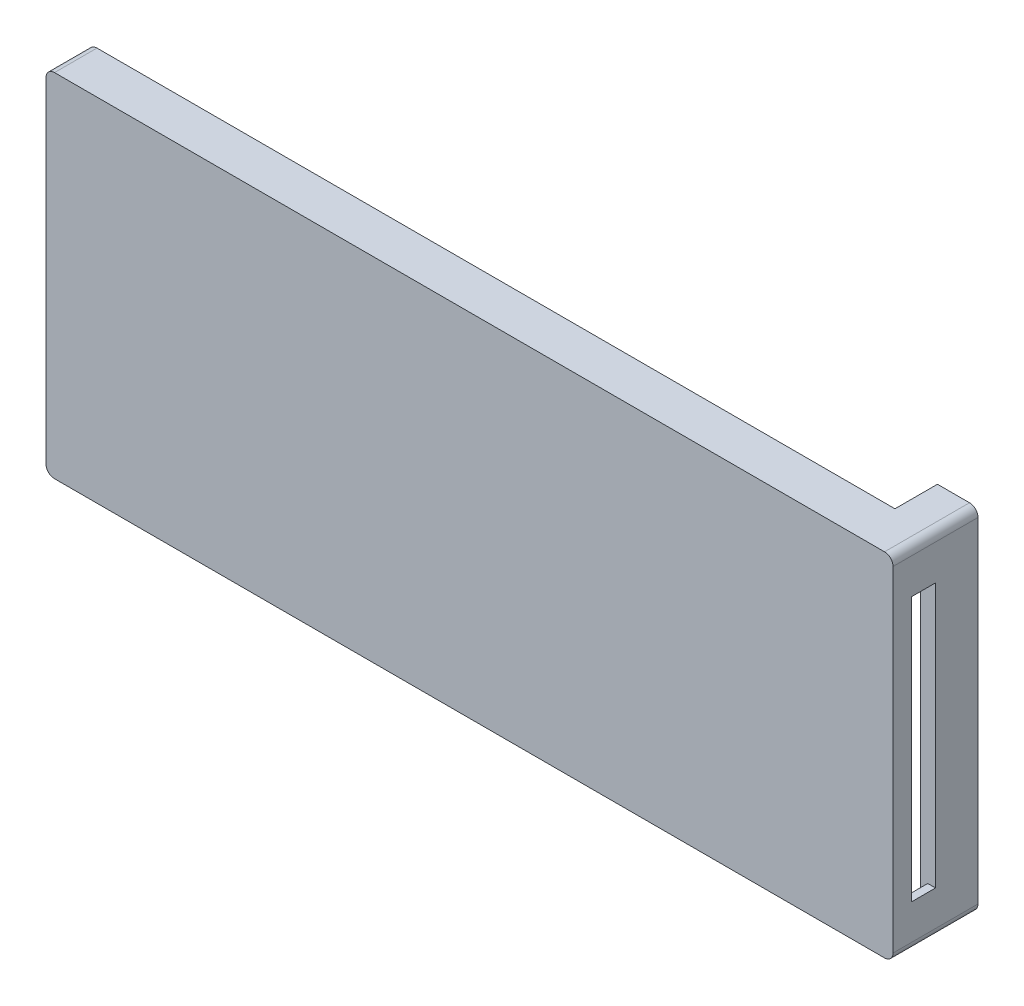
ISO-10303-21;
HEADER;
FILE_DESCRIPTION(('STEP AP214'),'2;1');
FILE_NAME('part.step','',(''),(''),'','','');
FILE_SCHEMA(('AUTOMOTIVE_DESIGN { 1 0 10303 214 1 1 1 1 }'));
ENDSEC;
DATA;
#1=APPLICATION_CONTEXT('core data for automotive mechanical design processes');
#2=APPLICATION_PROTOCOL_DEFINITION('international standard','automotive_design',2000,#1);
#3=PRODUCT_CONTEXT('',#1,'mechanical');
#4=PRODUCT('Part','Part','',(#3));
#5=PRODUCT_RELATED_PRODUCT_CATEGORY('part','',(#4));
#6=PRODUCT_DEFINITION_FORMATION('','',#4);
#7=PRODUCT_DEFINITION_CONTEXT('part definition',#1,'design');
#8=PRODUCT_DEFINITION('design','',#6,#7);
#9=PRODUCT_DEFINITION_SHAPE('','',#8);
#10=(LENGTH_UNIT() NAMED_UNIT(*) SI_UNIT(.MILLI.,.METRE.));
#11=(NAMED_UNIT(*) PLANE_ANGLE_UNIT() SI_UNIT($,.RADIAN.));
#12=(NAMED_UNIT(*) SI_UNIT($,.STERADIAN.) SOLID_ANGLE_UNIT());
#13=UNCERTAINTY_MEASURE_WITH_UNIT(LENGTH_MEASURE(1.E-05),#10,'distance_accuracy_value','');
#14=(GEOMETRIC_REPRESENTATION_CONTEXT(3) GLOBAL_UNCERTAINTY_ASSIGNED_CONTEXT((#13)) GLOBAL_UNIT_ASSIGNED_CONTEXT((#10,
#11,#12)) REPRESENTATION_CONTEXT('',''));
#15=CARTESIAN_POINT('',(0.,0.,0.));
#16=DIRECTION('',(0.,0.,1.));
#17=DIRECTION('',(1.,0.,0.));
#18=AXIS2_PLACEMENT_3D('',#15,#16,#17);
#19=CARTESIAN_POINT('',(0.,0.,10.));
#20=DIRECTION('',(1.,0.,0.));
#21=DIRECTION('',(0.,0.,-1.));
#22=AXIS2_PLACEMENT_3D('',#19,#20,#21);
#23=PLANE('',#22);
#24=DIRECTION('',(0.,-1.,0.));
#25=VECTOR('',#24,1.);
#26=CARTESIAN_POINT('',(0.,0.,0.));
#27=LINE('',#26,#25);
#28=CARTESIAN_POINT('',(0.,80.7933019594782,0.));
#29=VERTEX_POINT('',#28);
#30=CARTESIAN_POINT('',(0.,2.,0.));
#31=VERTEX_POINT('',#30);
#32=EDGE_CURVE('E309',#29,#31,#27,.T.);
#33=ORIENTED_EDGE('',*,*,#32,.T.);
#34=DIRECTION('',(0.,0.,-1.));
#35=VECTOR('',#34,1.);
#36=CARTESIAN_POINT('',(0.,2.,10.));
#37=LINE('',#36,#35);
#38=CARTESIAN_POINT('',(0.,2.,10.));
#39=VERTEX_POINT('',#38);
#40=EDGE_CURVE('E41',#31,#39,#37,.F.);
#41=ORIENTED_EDGE('',*,*,#40,.T.);
#42=DIRECTION('',(0.,-1.,0.));
#43=VECTOR('',#42,1.);
#44=CARTESIAN_POINT('',(0.,0.,10.));
#45=LINE('',#44,#43);
#46=CARTESIAN_POINT('',(0.,80.7933019594782,10.));
#47=VERTEX_POINT('',#46);
#48=EDGE_CURVE('E310',#47,#39,#45,.T.);
#49=ORIENTED_EDGE('',*,*,#48,.F.);
#50=DIRECTION('',(0.,0.,-1.));
#51=VECTOR('',#50,1.);
#52=CARTESIAN_POINT('',(0.,80.7933019594782,10.));
#53=LINE('',#52,#51);
#54=EDGE_CURVE('E346',#47,#29,#53,.T.);
#55=ORIENTED_EDGE('',*,*,#54,.T.);
#56=EDGE_LOOP('',(#33,#41,#49,#55));
#57=FACE_BOUND('',#56,.T.);
#58=ADVANCED_FACE('F33',(#57),#23,.F.);
#59=CARTESIAN_POINT('',(0.,0.,10.));
#60=DIRECTION('',(0.,1.,0.));
#61=DIRECTION('',(0.,0.,1.));
#62=AXIS2_PLACEMENT_3D('',#59,#60,#61);
#63=PLANE('',#62);
#64=DIRECTION('',(1.,0.,0.));
#65=VECTOR('',#64,1.);
#66=CARTESIAN_POINT('',(0.,0.,10.));
#67=LINE('',#66,#65);
#68=CARTESIAN_POINT('',(2.,0.,10.));
#69=VERTEX_POINT('',#68);
#70=CARTESIAN_POINT('',(197.383138686651,0.,10.));
#71=VERTEX_POINT('',#70);
#72=EDGE_CURVE('E312',#69,#71,#67,.T.);
#73=ORIENTED_EDGE('',*,*,#72,.F.);
#74=DIRECTION('',(0.,0.,-1.));
#75=VECTOR('',#74,1.);
#76=CARTESIAN_POINT('',(2.,0.,10.));
#77=LINE('',#76,#75);
#78=CARTESIAN_POINT('',(2.,0.,0.));
#79=VERTEX_POINT('',#78);
#80=EDGE_CURVE('E355',#69,#79,#77,.T.);
#81=ORIENTED_EDGE('',*,*,#80,.T.);
#82=DIRECTION('',(1.,0.,0.));
#83=VECTOR('',#82,1.);
#84=CARTESIAN_POINT('',(0.,0.,0.));
#85=LINE('',#84,#83);
#86=CARTESIAN_POINT('',(189.836382913627,0.,0.));
#87=VERTEX_POINT('',#86);
#88=EDGE_CURVE('E322',#79,#87,#85,.T.);
#89=ORIENTED_EDGE('',*,*,#88,.T.);
#90=DIRECTION('',(0.,0.,1.));
#91=VECTOR('',#90,1.);
#92=CARTESIAN_POINT('',(189.836382913627,0.,-10.));
#93=LINE('',#92,#91);
#94=CARTESIAN_POINT('',(189.836382913627,0.,-10.));
#95=VERTEX_POINT('',#94);
#96=EDGE_CURVE('E306',#95,#87,#93,.T.);
#97=ORIENTED_EDGE('',*,*,#96,.F.);
#98=DIRECTION('',(-1.,0.,0.));
#99=VECTOR('',#98,1.);
#100=CARTESIAN_POINT('',(199.383138686651,0.,-10.));
#101=LINE('',#100,#99);
#102=CARTESIAN_POINT('',(197.383138686651,0.,-10.));
#103=VERTEX_POINT('',#102);
#104=EDGE_CURVE('E293',#103,#95,#101,.T.);
#105=ORIENTED_EDGE('',*,*,#104,.F.);
#106=DIRECTION('',(0.,0.,-1.));
#107=VECTOR('',#106,1.);
#108=CARTESIAN_POINT('',(197.383138686651,0.,10.));
#109=LINE('',#108,#107);
#110=EDGE_CURVE('E332',#103,#71,#109,.F.);
#111=ORIENTED_EDGE('',*,*,#110,.T.);
#112=EDGE_LOOP('',(#73,#81,#89,#97,#105,#111));
#113=FACE_BOUND('',#112,.T.);
#114=ADVANCED_FACE('F361',(#113),#63,.F.);
#115=CARTESIAN_POINT('',(199.383138686651,0.,10.));
#116=DIRECTION('',(-1.,0.,0.));
#117=DIRECTION('',(0.,0.,1.));
#118=AXIS2_PLACEMENT_3D('',#115,#116,#117);
#119=PLANE('',#118);
#120=DIRECTION('',(0.,0.,1.));
#121=VECTOR('',#120,1.);
#122=CARTESIAN_POINT('',(199.383138686651,72.4624804425984,0.));
#123=LINE('',#122,#121);
#124=CARTESIAN_POINT('',(199.383138686651,72.4624804425984,0.));
#125=VERTEX_POINT('',#124);
#126=CARTESIAN_POINT('',(199.383138686651,72.4624804425984,5.65589454851079));
#127=VERTEX_POINT('',#126);
#128=EDGE_CURVE('E201',#125,#127,#123,.T.);
#129=ORIENTED_EDGE('',*,*,#128,.F.);
#130=DIRECTION('',(0.,1.,0.));
#131=VECTOR('',#130,1.);
#132=CARTESIAN_POINT('',(199.383138686651,72.4624804425984,0.));
#133=LINE('',#132,#131);
#134=CARTESIAN_POINT('',(199.383138686651,10.2646901312933,0.));
#135=VERTEX_POINT('',#134);
#136=EDGE_CURVE('E206',#135,#125,#133,.T.);
#137=ORIENTED_EDGE('',*,*,#136,.F.);
#138=DIRECTION('',(0.,0.,-1.));
#139=VECTOR('',#138,1.);
#140=CARTESIAN_POINT('',(199.383138686651,10.2646901312933,0.));
#141=LINE('',#140,#139);
#142=CARTESIAN_POINT('',(199.383138686651,10.2646901312933,5.65589454851079));
#143=VERTEX_POINT('',#142);
#144=EDGE_CURVE('E211',#143,#135,#141,.T.);
#145=ORIENTED_EDGE('',*,*,#144,.F.);
#146=DIRECTION('',(0.,-1.,0.));
#147=VECTOR('',#146,1.);
#148=CARTESIAN_POINT('',(199.383138686651,72.4624804425984,5.65589454851079));
#149=LINE('',#148,#147);
#150=EDGE_CURVE('E190',#127,#143,#149,.T.);
#151=ORIENTED_EDGE('',*,*,#150,.F.);
#152=EDGE_LOOP('',(#129,#137,#145,#151));
#153=FACE_BOUND('',#152,.T.);
#154=DIRECTION('',(0.,-1.,0.));
#155=VECTOR('',#154,1.);
#156=CARTESIAN_POINT('',(199.383138686651,82.7933019594782,-10.));
#157=LINE('',#156,#155);
#158=CARTESIAN_POINT('',(199.383138686651,80.7933019594782,-10.));
#159=VERTEX_POINT('',#158);
#160=CARTESIAN_POINT('',(199.383138686651,2.,-10.));
#161=VERTEX_POINT('',#160);
#162=EDGE_CURVE('E291',#159,#161,#157,.T.);
#163=ORIENTED_EDGE('',*,*,#162,.F.);
#164=DIRECTION('',(0.,0.,-1.));
#165=VECTOR('',#164,1.);
#166=CARTESIAN_POINT('',(199.383138686651,80.7933019594782,10.));
#167=LINE('',#166,#165);
#168=CARTESIAN_POINT('',(199.383138686651,80.7933019594782,10.));
#169=VERTEX_POINT('',#168);
#170=EDGE_CURVE('E342',#159,#169,#167,.F.);
#171=ORIENTED_EDGE('',*,*,#170,.T.);
#172=DIRECTION('',(0.,1.,0.));
#173=VECTOR('',#172,1.);
#174=CARTESIAN_POINT('',(199.383138686651,0.,10.));
#175=LINE('',#174,#173);
#176=CARTESIAN_POINT('',(199.383138686651,2.,10.));
#177=VERTEX_POINT('',#176);
#178=EDGE_CURVE('E315',#177,#169,#175,.T.);
#179=ORIENTED_EDGE('',*,*,#178,.F.);
#180=DIRECTION('',(0.,0.,-1.));
#181=VECTOR('',#180,1.);
#182=CARTESIAN_POINT('',(199.383138686651,2.,10.));
#183=LINE('',#182,#181);
#184=EDGE_CURVE('E327',#177,#161,#183,.T.);
#185=ORIENTED_EDGE('',*,*,#184,.T.);
#186=EDGE_LOOP('',(#163,#171,#179,#185));
#187=FACE_BOUND('',#186,.T.);
#188=ADVANCED_FACE('F208',(#153,#187),#119,.F.);
#189=CARTESIAN_POINT('',(0.,82.7933019594782,10.));
#190=DIRECTION('',(0.,-1.,0.));
#191=DIRECTION('',(0.,0.,-1.));
#192=AXIS2_PLACEMENT_3D('',#189,#190,#191);
#193=PLANE('',#192);
#194=DIRECTION('',(-1.,0.,0.));
#195=VECTOR('',#194,1.);
#196=CARTESIAN_POINT('',(0.,82.7933019594782,0.));
#197=LINE('',#196,#195);
#198=CARTESIAN_POINT('',(189.836382913627,82.7933019594782,0.));
#199=VERTEX_POINT('',#198);
#200=CARTESIAN_POINT('',(2.,82.7933019594782,0.));
#201=VERTEX_POINT('',#200);
#202=EDGE_CURVE('E313',#199,#201,#197,.T.);
#203=ORIENTED_EDGE('',*,*,#202,.T.);
#204=DIRECTION('',(0.,0.,-1.));
#205=VECTOR('',#204,1.);
#206=CARTESIAN_POINT('',(2.,82.7933019594782,10.));
#207=LINE('',#206,#205);
#208=CARTESIAN_POINT('',(2.,82.7933019594782,10.));
#209=VERTEX_POINT('',#208);
#210=EDGE_CURVE('E351',#201,#209,#207,.F.);
#211=ORIENTED_EDGE('',*,*,#210,.T.);
#212=DIRECTION('',(-1.,0.,0.));
#213=VECTOR('',#212,1.);
#214=CARTESIAN_POINT('',(0.,82.7933019594782,10.));
#215=LINE('',#214,#213);
#216=CARTESIAN_POINT('',(197.383138686651,82.7933019594782,10.));
#217=VERTEX_POINT('',#216);
#218=EDGE_CURVE('E318',#217,#209,#215,.T.);
#219=ORIENTED_EDGE('',*,*,#218,.F.);
#220=DIRECTION('',(0.,0.,-1.));
#221=VECTOR('',#220,1.);
#222=CARTESIAN_POINT('',(197.383138686651,82.7933019594782,10.));
#223=LINE('',#222,#221);
#224=CARTESIAN_POINT('',(197.383138686651,82.7933019594782,-10.));
#225=VERTEX_POINT('',#224);
#226=EDGE_CURVE('E337',#217,#225,#223,.T.);
#227=ORIENTED_EDGE('',*,*,#226,.T.);
#228=DIRECTION('',(1.,0.,0.));
#229=VECTOR('',#228,1.);
#230=CARTESIAN_POINT('',(199.383138686651,82.7933019594782,-10.));
#231=LINE('',#230,#229);
#232=CARTESIAN_POINT('',(189.836382913627,82.7933019594782,-10.));
#233=VERTEX_POINT('',#232);
#234=EDGE_CURVE('E298',#233,#225,#231,.T.);
#235=ORIENTED_EDGE('',*,*,#234,.F.);
#236=DIRECTION('',(0.,0.,1.));
#237=VECTOR('',#236,1.);
#238=CARTESIAN_POINT('',(189.836382913627,82.7933019594782,-10.));
#239=LINE('',#238,#237);
#240=EDGE_CURVE('E301',#233,#199,#239,.T.);
#241=ORIENTED_EDGE('',*,*,#240,.T.);
#242=EDGE_LOOP('',(#203,#211,#219,#227,#235,#241));
#243=FACE_BOUND('',#242,.T.);
#244=ADVANCED_FACE('F393',(#243),#193,.F.);
#245=CARTESIAN_POINT('',(0.,0.,10.));
#246=DIRECTION('',(0.,0.,-1.));
#247=DIRECTION('',(-1.,0.,0.));
#248=AXIS2_PLACEMENT_3D('',#245,#246,#247);
#249=PLANE('',#248);
#250=ORIENTED_EDGE('',*,*,#48,.T.);
#251=CARTESIAN_POINT('',(2.,2.,10.));
#252=DIRECTION('',(0.,0.,-1.));
#253=DIRECTION('',(-1.,0.,0.));
#254=AXIS2_PLACEMENT_3D('',#251,#252,#253);
#255=CIRCLE('',#254,2.);
#256=EDGE_CURVE('E11',#39,#69,#255,.F.);
#257=ORIENTED_EDGE('',*,*,#256,.T.);
#258=ORIENTED_EDGE('',*,*,#72,.T.);
#259=CARTESIAN_POINT('',(197.383138686651,2.,10.));
#260=DIRECTION('',(0.,0.,-1.));
#261=DIRECTION('',(-1.,0.,0.));
#262=AXIS2_PLACEMENT_3D('',#259,#260,#261);
#263=CIRCLE('',#262,2.);
#264=EDGE_CURVE('E335',#71,#177,#263,.F.);
#265=ORIENTED_EDGE('',*,*,#264,.T.);
#266=ORIENTED_EDGE('',*,*,#178,.T.);
#267=CARTESIAN_POINT('',(197.383138686651,80.7933019594782,10.));
#268=DIRECTION('',(0.,0.,-1.));
#269=DIRECTION('',(-1.,0.,0.));
#270=AXIS2_PLACEMENT_3D('',#267,#268,#269);
#271=CIRCLE('',#270,2.);
#272=EDGE_CURVE('E344',#169,#217,#271,.F.);
#273=ORIENTED_EDGE('',*,*,#272,.T.);
#274=ORIENTED_EDGE('',*,*,#218,.T.);
#275=CARTESIAN_POINT('',(2.,80.7933019594782,10.));
#276=DIRECTION('',(0.,0.,-1.));
#277=DIRECTION('',(-1.,0.,0.));
#278=AXIS2_PLACEMENT_3D('',#275,#276,#277);
#279=CIRCLE('',#278,2.);
#280=EDGE_CURVE('E353',#209,#47,#279,.F.);
#281=ORIENTED_EDGE('',*,*,#280,.T.);
#282=EDGE_LOOP('',(#250,#257,#258,#265,#266,#273,#274,#281));
#283=FACE_BOUND('',#282,.T.);
#284=ADVANCED_FACE('F383',(#283),#249,.F.);
#285=CARTESIAN_POINT('',(0.,0.,0.));
#286=DIRECTION('',(0.,0.,-1.));
#287=DIRECTION('',(-1.,0.,0.));
#288=AXIS2_PLACEMENT_3D('',#285,#286,#287);
#289=PLANE('',#288);
#290=ORIENTED_EDGE('',*,*,#88,.F.);
#291=CARTESIAN_POINT('',(2.,2.,0.));
#292=DIRECTION('',(0.,0.,-1.));
#293=DIRECTION('',(-1.,0.,0.));
#294=AXIS2_PLACEMENT_3D('',#291,#292,#293);
#295=CIRCLE('',#294,2.);
#296=EDGE_CURVE('E55',#79,#31,#295,.T.);
#297=ORIENTED_EDGE('',*,*,#296,.T.);
#298=ORIENTED_EDGE('',*,*,#32,.F.);
#299=CARTESIAN_POINT('',(2.,80.7933019594782,0.));
#300=DIRECTION('',(0.,0.,-1.));
#301=DIRECTION('',(-1.,0.,0.));
#302=AXIS2_PLACEMENT_3D('',#299,#300,#301);
#303=CIRCLE('',#302,2.);
#304=EDGE_CURVE('E349',#29,#201,#303,.T.);
#305=ORIENTED_EDGE('',*,*,#304,.T.);
#306=ORIENTED_EDGE('',*,*,#202,.F.);
#307=DIRECTION('',(0.,1.,0.));
#308=VECTOR('',#307,1.);
#309=CARTESIAN_POINT('',(189.836382913627,82.7933019594782,0.));
#310=LINE('',#309,#308);
#311=CARTESIAN_POINT('',(189.836382913627,81.3364703952557,0.));
#312=VERTEX_POINT('',#311);
#313=EDGE_CURVE('E287',#312,#199,#310,.T.);
#314=ORIENTED_EDGE('',*,*,#313,.F.);
#315=DIRECTION('',(1.,0.,0.));
#316=VECTOR('',#315,1.);
#317=CARTESIAN_POINT('',(197.551380452353,81.3364703952557,0.));
#318=LINE('',#317,#316);
#319=CARTESIAN_POINT('',(2.68016367539303,81.3364703952557,0.));
#320=VERTEX_POINT('',#319);
#321=EDGE_CURVE('E230',#320,#312,#318,.T.);
#322=ORIENTED_EDGE('',*,*,#321,.F.);
#323=DIRECTION('',(0.,1.,0.));
#324=VECTOR('',#323,1.);
#325=CARTESIAN_POINT('',(2.68016367539303,81.3364703952557,0.));
#326=LINE('',#325,#324);
#327=CARTESIAN_POINT('',(2.68016367539303,3.41795799017142,0.));
#328=VERTEX_POINT('',#327);
#329=EDGE_CURVE('E247',#328,#320,#326,.T.);
#330=ORIENTED_EDGE('',*,*,#329,.F.);
#331=DIRECTION('',(-1.,0.,0.));
#332=VECTOR('',#331,1.);
#333=CARTESIAN_POINT('',(197.551380452353,3.41795799017142,0.));
#334=LINE('',#333,#332);
#335=CARTESIAN_POINT('',(195.836382913627,3.41795799017142,0.));
#336=VERTEX_POINT('',#335);
#337=EDGE_CURVE('E243',#336,#328,#334,.T.);
#338=ORIENTED_EDGE('',*,*,#337,.F.);
#339=DIRECTION('',(0.,1.,0.));
#340=VECTOR('',#339,1.);
#341=CARTESIAN_POINT('',(195.836382913627,1.09862690578743,0.));
#342=LINE('',#341,#340);
#343=CARTESIAN_POINT('',(195.836382913627,1.09862690578743,0.));
#344=VERTEX_POINT('',#343);
#345=EDGE_CURVE('E263',#344,#336,#342,.T.);
#346=ORIENTED_EDGE('',*,*,#345,.F.);
#347=DIRECTION('',(-1.,0.,0.));
#348=VECTOR('',#347,1.);
#349=CARTESIAN_POINT('',(195.836382913627,1.09862690578743,0.));
#350=LINE('',#349,#348);
#351=CARTESIAN_POINT('',(189.836382913627,1.09862690578743,0.));
#352=VERTEX_POINT('',#351);
#353=EDGE_CURVE('E285',#344,#352,#350,.T.);
#354=ORIENTED_EDGE('',*,*,#353,.T.);
#355=EDGE_CURVE('E294',#87,#352,#310,.T.);
#356=ORIENTED_EDGE('',*,*,#355,.F.);
#357=EDGE_LOOP('',(#290,#297,#298,#305,#306,#314,#322,#330,#338,#346,#354,#356));
#358=FACE_BOUND('',#357,.T.);
#359=ADVANCED_FACE('F366',(#358),#289,.T.);
#360=CARTESIAN_POINT('',(189.836382913627,82.7933019594782,-10.));
#361=DIRECTION('',(1.,0.,0.));
#362=DIRECTION('',(0.,0.,-1.));
#363=AXIS2_PLACEMENT_3D('',#360,#361,#362);
#364=PLANE('',#363);
#365=ORIENTED_EDGE('',*,*,#355,.T.);
#366=DIRECTION('',(0.,0.,1.));
#367=VECTOR('',#366,1.);
#368=CARTESIAN_POINT('',(189.836382913627,1.09862690578743,0.));
#369=LINE('',#368,#367);
#370=CARTESIAN_POINT('',(189.836382913627,1.09862690578743,-7.5222978271366));
#371=VERTEX_POINT('',#370);
#372=EDGE_CURVE('E282',#371,#352,#369,.T.);
#373=ORIENTED_EDGE('',*,*,#372,.F.);
#374=DIRECTION('',(0.,-1.,0.));
#375=VECTOR('',#374,1.);
#376=CARTESIAN_POINT('',(189.836382913627,1.09862690578743,-7.5222978271366));
#377=LINE('',#376,#375);
#378=CARTESIAN_POINT('',(189.836382913627,81.3364703952557,-7.5222978271366));
#379=VERTEX_POINT('',#378);
#380=EDGE_CURVE('E279',#379,#371,#377,.T.);
#381=ORIENTED_EDGE('',*,*,#380,.F.);
#382=DIRECTION('',(0.,0.,-1.));
#383=VECTOR('',#382,1.);
#384=CARTESIAN_POINT('',(189.836382913627,81.3364703952557,0.));
#385=LINE('',#384,#383);
#386=EDGE_CURVE('E255',#312,#379,#385,.T.);
#387=ORIENTED_EDGE('',*,*,#386,.F.);
#388=ORIENTED_EDGE('',*,*,#313,.T.);
#389=ORIENTED_EDGE('',*,*,#240,.F.);
#390=DIRECTION('',(0.,1.,0.));
#391=VECTOR('',#390,1.);
#392=CARTESIAN_POINT('',(189.836382913627,82.7933019594782,-10.));
#393=LINE('',#392,#391);
#394=EDGE_CURVE('E296',#95,#233,#393,.T.);
#395=ORIENTED_EDGE('',*,*,#394,.F.);
#396=ORIENTED_EDGE('',*,*,#96,.T.);
#397=EDGE_LOOP('',(#365,#373,#381,#387,#388,#389,#395,#396));
#398=FACE_BOUND('',#397,.T.);
#399=ADVANCED_FACE('F371',(#398),#364,.F.);
#400=CARTESIAN_POINT('',(0.,0.,-10.));
#401=DIRECTION('',(0.,0.,-1.));
#402=DIRECTION('',(-1.,0.,0.));
#403=AXIS2_PLACEMENT_3D('',#400,#401,#402);
#404=PLANE('',#403);
#405=ORIENTED_EDGE('',*,*,#234,.T.);
#406=CARTESIAN_POINT('',(197.383138686651,80.7933019594782,-10.));
#407=DIRECTION('',(0.,0.,-1.));
#408=DIRECTION('',(-1.,0.,0.));
#409=AXIS2_PLACEMENT_3D('',#406,#407,#408);
#410=CIRCLE('',#409,2.);
#411=EDGE_CURVE('E340',#225,#159,#410,.T.);
#412=ORIENTED_EDGE('',*,*,#411,.T.);
#413=ORIENTED_EDGE('',*,*,#162,.T.);
#414=CARTESIAN_POINT('',(197.383138686651,2.,-10.));
#415=DIRECTION('',(0.,0.,-1.));
#416=DIRECTION('',(-1.,0.,0.));
#417=AXIS2_PLACEMENT_3D('',#414,#415,#416);
#418=CIRCLE('',#417,2.);
#419=EDGE_CURVE('E330',#161,#103,#418,.T.);
#420=ORIENTED_EDGE('',*,*,#419,.T.);
#421=ORIENTED_EDGE('',*,*,#104,.T.);
#422=ORIENTED_EDGE('',*,*,#394,.T.);
#423=EDGE_LOOP('',(#405,#412,#413,#420,#421,#422));
#424=FACE_BOUND('',#423,.T.);
#425=ADVANCED_FACE('F437',(#424),#404,.T.);
#426=CARTESIAN_POINT('',(195.836382913627,1.09862690578743,0.));
#427=DIRECTION('',(0.,-1.,0.));
#428=DIRECTION('',(0.,0.,-1.));
#429=AXIS2_PLACEMENT_3D('',#426,#427,#428);
#430=PLANE('',#429);
#431=ORIENTED_EDGE('',*,*,#372,.T.);
#432=ORIENTED_EDGE('',*,*,#353,.F.);
#433=DIRECTION('',(0.,0.,1.));
#434=VECTOR('',#433,1.);
#435=CARTESIAN_POINT('',(195.836382913627,1.09862690578743,0.));
#436=LINE('',#435,#434);
#437=CARTESIAN_POINT('',(195.836382913627,1.09862690578743,-7.5222978271366));
#438=VERTEX_POINT('',#437);
#439=EDGE_CURVE('E273',#438,#344,#436,.T.);
#440=ORIENTED_EDGE('',*,*,#439,.F.);
#441=DIRECTION('',(-1.,0.,0.));
#442=VECTOR('',#441,1.);
#443=CARTESIAN_POINT('',(195.836382913627,1.09862690578743,-7.5222978271366));
#444=LINE('',#443,#442);
#445=EDGE_CURVE('E288',#438,#371,#444,.T.);
#446=ORIENTED_EDGE('',*,*,#445,.T.);
#447=EDGE_LOOP('',(#431,#432,#440,#446));
#448=FACE_BOUND('',#447,.T.);
#449=ADVANCED_FACE('F427',(#448),#430,.F.);
#450=CARTESIAN_POINT('',(195.836382913627,1.09862690578743,-7.5222978271366));
#451=DIRECTION('',(0.,0.,-1.));
#452=DIRECTION('',(-1.,0.,0.));
#453=AXIS2_PLACEMENT_3D('',#450,#451,#452);
#454=PLANE('',#453);
#455=ORIENTED_EDGE('',*,*,#380,.T.);
#456=ORIENTED_EDGE('',*,*,#445,.F.);
#457=DIRECTION('',(0.,-1.,0.));
#458=VECTOR('',#457,1.);
#459=CARTESIAN_POINT('',(195.836382913627,1.09862690578743,-7.5222978271366));
#460=LINE('',#459,#458);
#461=CARTESIAN_POINT('',(195.836382913627,81.3364703952557,-7.5222978271366));
#462=VERTEX_POINT('',#461);
#463=EDGE_CURVE('E270',#462,#438,#460,.T.);
#464=ORIENTED_EDGE('',*,*,#463,.F.);
#465=DIRECTION('',(-1.,0.,0.));
#466=VECTOR('',#465,1.);
#467=CARTESIAN_POINT('',(195.836382913627,81.3364703952557,-7.5222978271366));
#468=LINE('',#467,#466);
#469=EDGE_CURVE('E276',#462,#379,#468,.T.);
#470=ORIENTED_EDGE('',*,*,#469,.T.);
#471=EDGE_LOOP('',(#455,#456,#464,#470));
#472=FACE_BOUND('',#471,.T.);
#473=ADVANCED_FACE('F429',(#472),#454,.F.);
#474=CARTESIAN_POINT('',(195.836382913627,81.3364703952557,0.));
#475=DIRECTION('',(0.,1.,0.));
#476=DIRECTION('',(0.,0.,1.));
#477=AXIS2_PLACEMENT_3D('',#474,#475,#476);
#478=PLANE('',#477);
#479=ORIENTED_EDGE('',*,*,#386,.T.);
#480=ORIENTED_EDGE('',*,*,#469,.F.);
#481=DIRECTION('',(0.,0.,-1.));
#482=VECTOR('',#481,1.);
#483=CARTESIAN_POINT('',(195.836382913627,81.3364703952557,0.));
#484=LINE('',#483,#482);
#485=CARTESIAN_POINT('',(195.836382913627,81.3364703952557,0.));
#486=VERTEX_POINT('',#485);
#487=EDGE_CURVE('E266',#486,#462,#484,.T.);
#488=ORIENTED_EDGE('',*,*,#487,.F.);
#489=CARTESIAN_POINT('',(197.551380452353,81.3364703952557,0.));
#490=VERTEX_POINT('',#489);
#491=EDGE_CURVE('E250',#486,#490,#318,.T.);
#492=ORIENTED_EDGE('',*,*,#491,.T.);
#493=DIRECTION('',(0.,0.,-1.));
#494=VECTOR('',#493,1.);
#495=CARTESIAN_POINT('',(197.551380452353,81.3364703952557,6.));
#496=LINE('',#495,#494);
#497=CARTESIAN_POINT('',(197.551380452353,81.3364703952557,6.));
#498=VERTEX_POINT('',#497);
#499=EDGE_CURVE('E252',#498,#490,#496,.T.);
#500=ORIENTED_EDGE('',*,*,#499,.F.);
#501=DIRECTION('',(1.,0.,0.));
#502=VECTOR('',#501,1.);
#503=CARTESIAN_POINT('',(197.551380452353,81.3364703952557,6.));
#504=LINE('',#503,#502);
#505=CARTESIAN_POINT('',(2.68016367539303,81.3364703952557,6.));
#506=VERTEX_POINT('',#505);
#507=EDGE_CURVE('E236',#506,#498,#504,.T.);
#508=ORIENTED_EDGE('',*,*,#507,.F.);
#509=DIRECTION('',(0.,0.,-1.));
#510=VECTOR('',#509,1.);
#511=CARTESIAN_POINT('',(2.68016367539303,81.3364703952557,6.));
#512=LINE('',#511,#510);
#513=EDGE_CURVE('E256',#506,#320,#512,.T.);
#514=ORIENTED_EDGE('',*,*,#513,.T.);
#515=ORIENTED_EDGE('',*,*,#321,.T.);
#516=EDGE_LOOP('',(#479,#480,#488,#492,#500,#508,#514,#515));
#517=FACE_BOUND('',#516,.T.);
#518=ADVANCED_FACE('F405',(#517),#478,.F.);
#519=CARTESIAN_POINT('',(195.836382913627,0.,0.));
#520=DIRECTION('',(-1.,0.,0.));
#521=DIRECTION('',(0.,0.,1.));
#522=AXIS2_PLACEMENT_3D('',#519,#520,#521);
#523=PLANE('',#522);
#524=ORIENTED_EDGE('',*,*,#345,.T.);
#525=EDGE_CURVE('E267',#336,#486,#342,.T.);
#526=ORIENTED_EDGE('',*,*,#525,.T.);
#527=ORIENTED_EDGE('',*,*,#487,.T.);
#528=ORIENTED_EDGE('',*,*,#463,.T.);
#529=ORIENTED_EDGE('',*,*,#439,.T.);
#530=EDGE_LOOP('',(#524,#526,#527,#528,#529));
#531=FACE_BOUND('',#530,.T.);
#532=ADVANCED_FACE('F424',(#531),#523,.T.);
#533=CARTESIAN_POINT('',(197.551380452353,81.3364703952557,6.));
#534=DIRECTION('',(1.,0.,0.));
#535=DIRECTION('',(0.,0.,-1.));
#536=AXIS2_PLACEMENT_3D('',#533,#534,#535);
#537=PLANE('',#536);
#538=DIRECTION('',(0.,-1.,0.));
#539=VECTOR('',#538,1.);
#540=CARTESIAN_POINT('',(197.551380452353,81.3364703952557,5.65589454851079));
#541=LINE('',#540,#539);
#542=CARTESIAN_POINT('',(197.551380452353,72.4624804425984,5.65589454851079));
#543=VERTEX_POINT('',#542);
#544=CARTESIAN_POINT('',(197.551380452353,10.2646901312933,5.65589454851079));
#545=VERTEX_POINT('',#544);
#546=EDGE_CURVE('E193',#543,#545,#541,.T.);
#547=ORIENTED_EDGE('',*,*,#546,.T.);
#548=DIRECTION('',(0.,0.,-1.));
#549=VECTOR('',#548,1.);
#550=CARTESIAN_POINT('',(197.551380452353,10.2646901312933,6.));
#551=LINE('',#550,#549);
#552=CARTESIAN_POINT('',(197.551380452353,10.2646901312933,0.));
#553=VERTEX_POINT('',#552);
#554=EDGE_CURVE('E222',#545,#553,#551,.T.);
#555=ORIENTED_EDGE('',*,*,#554,.T.);
#556=DIRECTION('',(0.,-1.,0.));
#557=VECTOR('',#556,1.);
#558=CARTESIAN_POINT('',(197.551380452353,81.3364703952557,0.));
#559=LINE('',#558,#557);
#560=CARTESIAN_POINT('',(197.551380452353,3.41795799017142,0.));
#561=VERTEX_POINT('',#560);
#562=EDGE_CURVE('E225',#553,#561,#559,.T.);
#563=ORIENTED_EDGE('',*,*,#562,.T.);
#564=DIRECTION('',(0.,0.,-1.));
#565=VECTOR('',#564,1.);
#566=CARTESIAN_POINT('',(197.551380452353,3.41795799017142,6.));
#567=LINE('',#566,#565);
#568=CARTESIAN_POINT('',(197.551380452353,3.41795799017142,6.));
#569=VERTEX_POINT('',#568);
#570=EDGE_CURVE('E239',#569,#561,#567,.T.);
#571=ORIENTED_EDGE('',*,*,#570,.F.);
#572=DIRECTION('',(0.,-1.,0.));
#573=VECTOR('',#572,1.);
#574=CARTESIAN_POINT('',(197.551380452353,81.3364703952557,6.));
#575=LINE('',#574,#573);
#576=EDGE_CURVE('E226',#498,#569,#575,.T.);
#577=ORIENTED_EDGE('',*,*,#576,.F.);
#578=ORIENTED_EDGE('',*,*,#499,.T.);
#579=CARTESIAN_POINT('',(197.551380452353,72.4624804425984,0.));
#580=VERTEX_POINT('',#579);
#581=EDGE_CURVE('E240',#490,#580,#559,.T.);
#582=ORIENTED_EDGE('',*,*,#581,.T.);
#583=DIRECTION('',(0.,0.,1.));
#584=VECTOR('',#583,1.);
#585=CARTESIAN_POINT('',(197.551380452353,72.4624804425984,6.));
#586=LINE('',#585,#584);
#587=EDGE_CURVE('E218',#580,#543,#586,.T.);
#588=ORIENTED_EDGE('',*,*,#587,.T.);
#589=EDGE_LOOP('',(#547,#555,#563,#571,#577,#578,#582,#588));
#590=FACE_BOUND('',#589,.T.);
#591=ADVANCED_FACE('F570',(#590),#537,.F.);
#592=CARTESIAN_POINT('',(2.68016367539303,81.3364703952557,6.));
#593=DIRECTION('',(-1.,0.,0.));
#594=DIRECTION('',(0.,0.,1.));
#595=AXIS2_PLACEMENT_3D('',#592,#593,#594);
#596=PLANE('',#595);
#597=ORIENTED_EDGE('',*,*,#329,.T.);
#598=ORIENTED_EDGE('',*,*,#513,.F.);
#599=DIRECTION('',(0.,1.,0.));
#600=VECTOR('',#599,1.);
#601=CARTESIAN_POINT('',(2.68016367539303,81.3364703952557,6.));
#602=LINE('',#601,#600);
#603=CARTESIAN_POINT('',(2.68016367539303,3.41795799017142,6.));
#604=VERTEX_POINT('',#603);
#605=EDGE_CURVE('E233',#604,#506,#602,.T.);
#606=ORIENTED_EDGE('',*,*,#605,.F.);
#607=DIRECTION('',(0.,0.,-1.));
#608=VECTOR('',#607,1.);
#609=CARTESIAN_POINT('',(2.68016367539303,3.41795799017142,6.));
#610=LINE('',#609,#608);
#611=EDGE_CURVE('E258',#604,#328,#610,.T.);
#612=ORIENTED_EDGE('',*,*,#611,.T.);
#613=EDGE_LOOP('',(#597,#598,#606,#612));
#614=FACE_BOUND('',#613,.T.);
#615=ADVANCED_FACE('F412',(#614),#596,.F.);
#616=CARTESIAN_POINT('',(197.551380452353,3.41795799017142,6.));
#617=DIRECTION('',(0.,-1.,0.));
#618=DIRECTION('',(0.,0.,-1.));
#619=AXIS2_PLACEMENT_3D('',#616,#617,#618);
#620=PLANE('',#619);
#621=EDGE_CURVE('E244',#561,#336,#334,.T.);
#622=ORIENTED_EDGE('',*,*,#621,.T.);
#623=ORIENTED_EDGE('',*,*,#337,.T.);
#624=ORIENTED_EDGE('',*,*,#611,.F.);
#625=DIRECTION('',(-1.,0.,0.));
#626=VECTOR('',#625,1.);
#627=CARTESIAN_POINT('',(197.551380452353,3.41795799017142,6.));
#628=LINE('',#627,#626);
#629=EDGE_CURVE('E229',#569,#604,#628,.T.);
#630=ORIENTED_EDGE('',*,*,#629,.F.);
#631=ORIENTED_EDGE('',*,*,#570,.T.);
#632=EDGE_LOOP('',(#622,#623,#624,#630,#631));
#633=FACE_BOUND('',#632,.T.);
#634=ADVANCED_FACE('F416',(#633),#620,.F.);
#635=CARTESIAN_POINT('',(0.,0.,6.));
#636=DIRECTION('',(0.,0.,-1.));
#637=DIRECTION('',(-1.,0.,0.));
#638=AXIS2_PLACEMENT_3D('',#635,#636,#637);
#639=PLANE('',#638);
#640=ORIENTED_EDGE('',*,*,#576,.T.);
#641=ORIENTED_EDGE('',*,*,#629,.T.);
#642=ORIENTED_EDGE('',*,*,#605,.T.);
#643=ORIENTED_EDGE('',*,*,#507,.T.);
#644=EDGE_LOOP('',(#640,#641,#642,#643));
#645=FACE_BOUND('',#644,.T.);
#646=ADVANCED_FACE('F563',(#645),#639,.T.);
#647=CARTESIAN_POINT('',(0.,0.,0.));
#648=DIRECTION('',(0.,0.,-1.));
#649=DIRECTION('',(-1.,0.,0.));
#650=AXIS2_PLACEMENT_3D('',#647,#648,#649);
#651=PLANE('',#650);
#652=ORIENTED_EDGE('',*,*,#491,.F.);
#653=ORIENTED_EDGE('',*,*,#525,.F.);
#654=ORIENTED_EDGE('',*,*,#621,.F.);
#655=ORIENTED_EDGE('',*,*,#562,.F.);
#656=DIRECTION('',(1.,0.,0.));
#657=VECTOR('',#656,1.);
#658=CARTESIAN_POINT('',(193.383138686651,10.2646901312933,0.));
#659=LINE('',#658,#657);
#660=EDGE_CURVE('E216',#553,#135,#659,.T.);
#661=ORIENTED_EDGE('',*,*,#660,.T.);
#662=ORIENTED_EDGE('',*,*,#136,.T.);
#663=DIRECTION('',(1.,0.,0.));
#664=VECTOR('',#663,1.);
#665=CARTESIAN_POINT('',(193.383138686651,72.4624804425984,0.));
#666=LINE('',#665,#664);
#667=EDGE_CURVE('E197',#580,#125,#666,.T.);
#668=ORIENTED_EDGE('',*,*,#667,.F.);
#669=ORIENTED_EDGE('',*,*,#581,.F.);
#670=EDGE_LOOP('',(#652,#653,#654,#655,#661,#662,#668,#669));
#671=FACE_BOUND('',#670,.T.);
#672=ADVANCED_FACE('F421',(#671),#651,.F.);
#673=CARTESIAN_POINT('',(193.383138686651,72.4624804425984,5.65589454851079));
#674=DIRECTION('',(0.,0.,1.));
#675=DIRECTION('',(1.,0.,0.));
#676=AXIS2_PLACEMENT_3D('',#673,#674,#675);
#677=PLANE('',#676);
#678=DIRECTION('',(1.,0.,0.));
#679=VECTOR('',#678,1.);
#680=CARTESIAN_POINT('',(193.383138686651,72.4624804425984,5.65589454851079));
#681=LINE('',#680,#679);
#682=EDGE_CURVE('E185',#543,#127,#681,.T.);
#683=ORIENTED_EDGE('',*,*,#682,.T.);
#684=ORIENTED_EDGE('',*,*,#150,.T.);
#685=DIRECTION('',(1.,0.,0.));
#686=VECTOR('',#685,1.);
#687=CARTESIAN_POINT('',(193.383138686651,10.2646901312933,5.65589454851079));
#688=LINE('',#687,#686);
#689=EDGE_CURVE('E196',#545,#143,#688,.T.);
#690=ORIENTED_EDGE('',*,*,#689,.F.);
#691=ORIENTED_EDGE('',*,*,#546,.F.);
#692=EDGE_LOOP('',(#683,#684,#690,#691));
#693=FACE_BOUND('',#692,.T.);
#694=ADVANCED_FACE('F187',(#693),#677,.F.);
#695=CARTESIAN_POINT('',(193.383138686651,10.2646901312933,0.));
#696=DIRECTION('',(0.,-1.,0.));
#697=DIRECTION('',(0.,0.,-1.));
#698=AXIS2_PLACEMENT_3D('',#695,#696,#697);
#699=PLANE('',#698);
#700=ORIENTED_EDGE('',*,*,#689,.T.);
#701=ORIENTED_EDGE('',*,*,#144,.T.);
#702=ORIENTED_EDGE('',*,*,#660,.F.);
#703=ORIENTED_EDGE('',*,*,#554,.F.);
#704=EDGE_LOOP('',(#700,#701,#702,#703));
#705=FACE_BOUND('',#704,.T.);
#706=ADVANCED_FACE('F537',(#705),#699,.F.);
#707=CARTESIAN_POINT('',(193.383138686651,72.4624804425984,0.));
#708=DIRECTION('',(0.,1.,0.));
#709=DIRECTION('',(0.,0.,1.));
#710=AXIS2_PLACEMENT_3D('',#707,#708,#709);
#711=PLANE('',#710);
#712=ORIENTED_EDGE('',*,*,#667,.T.);
#713=ORIENTED_EDGE('',*,*,#128,.T.);
#714=ORIENTED_EDGE('',*,*,#682,.F.);
#715=ORIENTED_EDGE('',*,*,#587,.F.);
#716=EDGE_LOOP('',(#712,#713,#714,#715));
#717=FACE_BOUND('',#716,.T.);
#718=ADVANCED_FACE('F202',(#717),#711,.F.);
#719=CARTESIAN_POINT('',(197.383138686651,2.,10.));
#720=DIRECTION('',(0.,0.,-1.));
#721=DIRECTION('',(-1.,0.,0.));
#722=AXIS2_PLACEMENT_3D('',#719,#720,#721);
#723=CYLINDRICAL_SURFACE('',#722,2.);
#724=ORIENTED_EDGE('',*,*,#264,.F.);
#725=ORIENTED_EDGE('',*,*,#110,.F.);
#726=ORIENTED_EDGE('',*,*,#419,.F.);
#727=ORIENTED_EDGE('',*,*,#184,.F.);
#728=EDGE_LOOP('',(#724,#725,#726,#727));
#729=FACE_BOUND('',#728,.T.);
#730=ADVANCED_FACE('F379',(#729),#723,.T.);
#731=CARTESIAN_POINT('',(197.383138686651,80.7933019594782,10.));
#732=DIRECTION('',(0.,0.,-1.));
#733=DIRECTION('',(-1.,0.,0.));
#734=AXIS2_PLACEMENT_3D('',#731,#732,#733);
#735=CYLINDRICAL_SURFACE('',#734,2.);
#736=ORIENTED_EDGE('',*,*,#272,.F.);
#737=ORIENTED_EDGE('',*,*,#170,.F.);
#738=ORIENTED_EDGE('',*,*,#411,.F.);
#739=ORIENTED_EDGE('',*,*,#226,.F.);
#740=EDGE_LOOP('',(#736,#737,#738,#739));
#741=FACE_BOUND('',#740,.T.);
#742=ADVANCED_FACE('F388',(#741),#735,.T.);
#743=CARTESIAN_POINT('',(2.,80.7933019594782,10.));
#744=DIRECTION('',(0.,0.,-1.));
#745=DIRECTION('',(-1.,0.,0.));
#746=AXIS2_PLACEMENT_3D('',#743,#744,#745);
#747=CYLINDRICAL_SURFACE('',#746,2.);
#748=ORIENTED_EDGE('',*,*,#280,.F.);
#749=ORIENTED_EDGE('',*,*,#210,.F.);
#750=ORIENTED_EDGE('',*,*,#304,.F.);
#751=ORIENTED_EDGE('',*,*,#54,.F.);
#752=EDGE_LOOP('',(#748,#749,#750,#751));
#753=FACE_BOUND('',#752,.T.);
#754=ADVANCED_FACE('F398',(#753),#747,.T.);
#755=CARTESIAN_POINT('',(2.,2.,10.));
#756=DIRECTION('',(0.,0.,-1.));
#757=DIRECTION('',(-1.,0.,0.));
#758=AXIS2_PLACEMENT_3D('',#755,#756,#757);
#759=CYLINDRICAL_SURFACE('',#758,2.);
#760=ORIENTED_EDGE('',*,*,#256,.F.);
#761=ORIENTED_EDGE('',*,*,#40,.F.);
#762=ORIENTED_EDGE('',*,*,#296,.F.);
#763=ORIENTED_EDGE('',*,*,#80,.F.);
#764=EDGE_LOOP('',(#760,#761,#762,#763));
#765=FACE_BOUND('',#764,.T.);
#766=ADVANCED_FACE('F35',(#765),#759,.T.);
#767=CLOSED_SHELL('',(#58,#114,#188,#244,#284,#359,#399,#425,#449,#473,#518,#532,#591,#615,#634,
#646,#672,#694,#706,#718,#730,#742,#754,#766));
#768=MANIFOLD_SOLID_BREP('B2',#767);
#769=ADVANCED_BREP_SHAPE_REPRESENTATION('',(#18,#768),#14);
#770=SHAPE_DEFINITION_REPRESENTATION(#9,#769);
ENDSEC;
END-ISO-10303-21;
